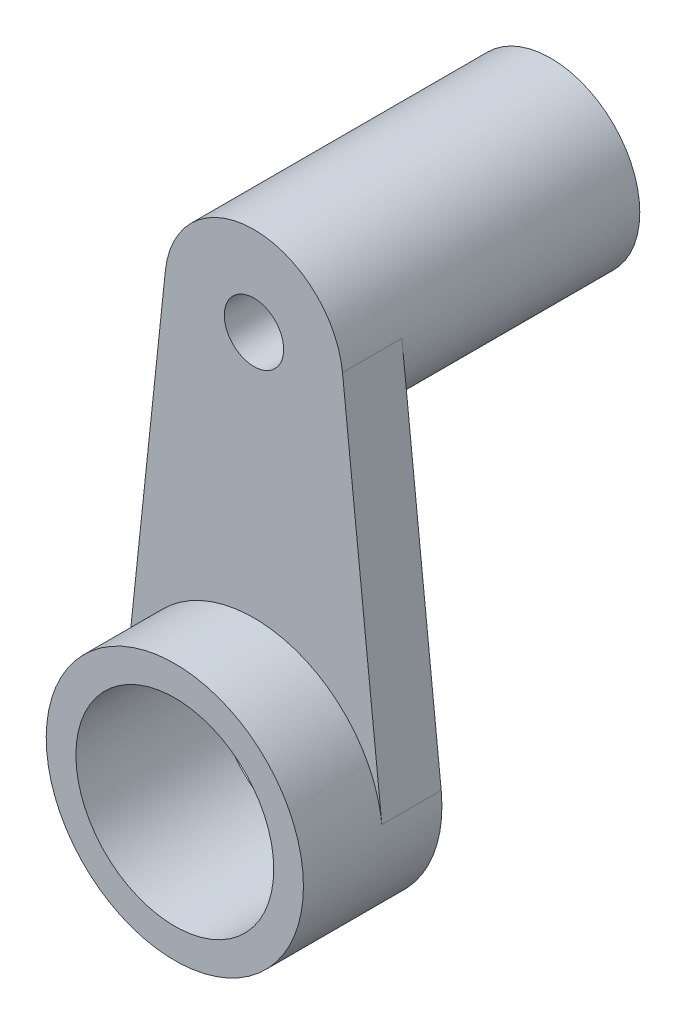
ISO-10303-21;
HEADER;
FILE_DESCRIPTION(('STEP AP214'),'2;1');
FILE_NAME('part.step','',(''),(''),'','','');
FILE_SCHEMA(('AUTOMOTIVE_DESIGN { 1 0 10303 214 1 1 1 1 }'));
ENDSEC;
DATA;
#1=APPLICATION_CONTEXT('core data for automotive mechanical design processes');
#2=APPLICATION_PROTOCOL_DEFINITION('international standard','automotive_design',2000,#1);
#3=PRODUCT_CONTEXT('',#1,'mechanical');
#4=PRODUCT('Part','Part','',(#3));
#5=PRODUCT_RELATED_PRODUCT_CATEGORY('part','',(#4));
#6=PRODUCT_DEFINITION_FORMATION('','',#4);
#7=PRODUCT_DEFINITION_CONTEXT('part definition',#1,'design');
#8=PRODUCT_DEFINITION('design','',#6,#7);
#9=PRODUCT_DEFINITION_SHAPE('','',#8);
#10=(LENGTH_UNIT() NAMED_UNIT(*) SI_UNIT(.MILLI.,.METRE.));
#11=(NAMED_UNIT(*) PLANE_ANGLE_UNIT() SI_UNIT($,.RADIAN.));
#12=(NAMED_UNIT(*) SI_UNIT($,.STERADIAN.) SOLID_ANGLE_UNIT());
#13=UNCERTAINTY_MEASURE_WITH_UNIT(LENGTH_MEASURE(1.E-05),#10,'distance_accuracy_value','');
#14=(GEOMETRIC_REPRESENTATION_CONTEXT(3) GLOBAL_UNCERTAINTY_ASSIGNED_CONTEXT((#13)) GLOBAL_UNIT_ASSIGNED_CONTEXT((#10,
#11,#12)) REPRESENTATION_CONTEXT('',''));
#15=CARTESIAN_POINT('',(0.,0.,0.));
#16=DIRECTION('',(0.,0.,1.));
#17=DIRECTION('',(1.,0.,0.));
#18=AXIS2_PLACEMENT_3D('',#15,#16,#17);
#19=CARTESIAN_POINT('',(0.,0.,6.));
#20=DIRECTION('',(0.,0.,-1.));
#21=DIRECTION('',(-1.,0.,0.));
#22=AXIS2_PLACEMENT_3D('',#19,#20,#21);
#23=CYLINDRICAL_SURFACE('',#22,13.);
#24=CARTESIAN_POINT('',(0.,0.,0.));
#25=DIRECTION('',(0.,0.,1.));
#26=DIRECTION('',(1.,0.,0.));
#27=AXIS2_PLACEMENT_3D('',#24,#25,#26);
#28=CIRCLE('',#27,13.);
#29=CARTESIAN_POINT('',(-12.9277772189466,1.36842105263158,0.));
#30=VERTEX_POINT('',#29);
#31=CARTESIAN_POINT('',(12.9277772189466,1.36842105263158,0.));
#32=VERTEX_POINT('',#31);
#33=EDGE_CURVE('E98',#30,#32,#28,.T.);
#34=ORIENTED_EDGE('',*,*,#33,.T.);
#35=DIRECTION('',(0.,0.,-1.));
#36=VECTOR('',#35,1.);
#37=CARTESIAN_POINT('',(12.9277772189466,1.36842105263158,6.));
#38=LINE('',#37,#36);
#39=CARTESIAN_POINT('',(12.9277772189466,1.36842105263158,6.));
#40=VERTEX_POINT('',#39);
#41=EDGE_CURVE('E48',#40,#32,#38,.T.);
#42=ORIENTED_EDGE('',*,*,#41,.F.);
#43=CARTESIAN_POINT('',(0.,0.,6.));
#44=DIRECTION('',(0.,0.,1.));
#45=DIRECTION('',(1.,0.,0.));
#46=AXIS2_PLACEMENT_3D('',#43,#44,#45);
#47=CIRCLE('',#46,13.);
#48=CARTESIAN_POINT('',(-12.9277772189466,1.36842105263158,6.));
#49=VERTEX_POINT('',#48);
#50=EDGE_CURVE('E125',#40,#49,#47,.T.);
#51=ORIENTED_EDGE('',*,*,#50,.T.);
#52=DIRECTION('',(0.,0.,-1.));
#53=VECTOR('',#52,1.);
#54=CARTESIAN_POINT('',(-12.9277772189466,1.36842105263158,6.));
#55=LINE('',#54,#53);
#56=EDGE_CURVE('E93',#49,#30,#55,.T.);
#57=ORIENTED_EDGE('',*,*,#56,.T.);
#58=EDGE_LOOP('',(#34,#42,#51,#57));
#59=FACE_BOUND('',#58,.T.);
#60=CARTESIAN_POINT('',(0.,0.,14.));
#61=DIRECTION('',(0.,0.,1.));
#62=DIRECTION('',(1.,0.,0.));
#63=AXIS2_PLACEMENT_3D('',#60,#61,#62);
#64=CIRCLE('',#63,13.);
#65=CARTESIAN_POINT('',(13.,0.,14.));
#66=VERTEX_POINT('',#65);
#67=EDGE_CURVE('E127',#66,#66,#64,.T.);
#68=ORIENTED_EDGE('',*,*,#67,.F.);
#69=EDGE_LOOP('',(#68));
#70=FACE_BOUND('',#69,.T.);
#71=ADVANCED_FACE('F39',(#59,#70),#23,.T.);
#72=CARTESIAN_POINT('',(12.9277772189466,1.36842105263158,6.));
#73=DIRECTION('',(-0.994444401457431,-0.105263157894737,0.));
#74=DIRECTION('',(0.105263157894737,-0.994444401457431,0.));
#75=AXIS2_PLACEMENT_3D('',#72,#73,#74);
#76=PLANE('',#75);
#77=DIRECTION('',(-0.105263157894737,0.994444401457431,0.));
#78=VECTOR('',#77,1.);
#79=CARTESIAN_POINT('',(12.9277772189466,1.36842105263158,0.));
#80=LINE('',#79,#78);
#81=CARTESIAN_POINT('',(8.94999961311688,38.9473684210526,0.));
#82=VERTEX_POINT('',#81);
#83=EDGE_CURVE('E99',#32,#82,#80,.T.);
#84=ORIENTED_EDGE('',*,*,#83,.T.);
#85=DIRECTION('',(0.,0.,-1.));
#86=VECTOR('',#85,1.);
#87=CARTESIAN_POINT('',(8.94999961311688,38.9473684210526,6.));
#88=LINE('',#87,#86);
#89=CARTESIAN_POINT('',(8.94999961311688,38.9473684210526,6.));
#90=VERTEX_POINT('',#89);
#91=EDGE_CURVE('E91',#90,#82,#88,.T.);
#92=ORIENTED_EDGE('',*,*,#91,.F.);
#93=DIRECTION('',(-0.105263157894737,0.994444401457431,0.));
#94=VECTOR('',#93,1.);
#95=CARTESIAN_POINT('',(12.9277772189466,1.36842105263158,6.));
#96=LINE('',#95,#94);
#97=EDGE_CURVE('E78',#40,#90,#96,.T.);
#98=ORIENTED_EDGE('',*,*,#97,.F.);
#99=ORIENTED_EDGE('',*,*,#41,.T.);
#100=EDGE_LOOP('',(#84,#92,#98,#99));
#101=FACE_BOUND('',#100,.T.);
#102=ADVANCED_FACE('F149',(#101),#76,.F.);
#103=CARTESIAN_POINT('',(0.,38.,6.));
#104=DIRECTION('',(0.,0.,-1.));
#105=DIRECTION('',(-1.,0.,0.));
#106=AXIS2_PLACEMENT_3D('',#103,#104,#105);
#107=CYLINDRICAL_SURFACE('',#106,9.);
#108=ORIENTED_EDGE('',*,*,#91,.T.);
#109=CARTESIAN_POINT('',(0.,38.,0.));
#110=DIRECTION('',(0.,0.,1.));
#111=DIRECTION('',(1.,0.,0.));
#112=AXIS2_PLACEMENT_3D('',#109,#110,#111);
#113=CIRCLE('',#112,9.);
#114=CARTESIAN_POINT('',(-8.94999961311688,38.9473684210526,0.));
#115=VERTEX_POINT('',#114);
#116=EDGE_CURVE('E11',#115,#82,#113,.T.);
#117=ORIENTED_EDGE('',*,*,#116,.F.);
#118=DIRECTION('',(0.,0.,-1.));
#119=VECTOR('',#118,1.);
#120=CARTESIAN_POINT('',(-8.94999961311687,38.9473684210526,6.));
#121=LINE('',#120,#119);
#122=CARTESIAN_POINT('',(-8.94999961311687,38.9473684210526,6.));
#123=VERTEX_POINT('',#122);
#124=EDGE_CURVE('E90',#123,#115,#121,.T.);
#125=ORIENTED_EDGE('',*,*,#124,.F.);
#126=CARTESIAN_POINT('',(0.,38.,6.));
#127=DIRECTION('',(0.,0.,1.));
#128=DIRECTION('',(1.,0.,0.));
#129=AXIS2_PLACEMENT_3D('',#126,#127,#128);
#130=CIRCLE('',#129,9.);
#131=EDGE_CURVE('E101',#90,#123,#130,.T.);
#132=ORIENTED_EDGE('',*,*,#131,.F.);
#133=EDGE_LOOP('',(#108,#117,#125,#132));
#134=FACE_BOUND('',#133,.T.);
#135=CARTESIAN_POINT('',(0.,38.,-24.));
#136=DIRECTION('',(0.,0.,1.));
#137=DIRECTION('',(1.,0.,0.));
#138=AXIS2_PLACEMENT_3D('',#135,#136,#137);
#139=CIRCLE('',#138,9.);
#140=CARTESIAN_POINT('',(9.,38.,-24.));
#141=VERTEX_POINT('',#140);
#142=EDGE_CURVE('E123',#141,#141,#139,.T.);
#143=ORIENTED_EDGE('',*,*,#142,.T.);
#144=EDGE_LOOP('',(#143));
#145=FACE_BOUND('',#144,.T.);
#146=ADVANCED_FACE('F87',(#134,#145),#107,.T.);
#147=CARTESIAN_POINT('',(-12.9277772189466,1.36842105263158,6.));
#148=DIRECTION('',(0.994444401457431,-0.105263157894737,0.));
#149=DIRECTION('',(0.105263157894737,0.994444401457431,0.));
#150=AXIS2_PLACEMENT_3D('',#147,#148,#149);
#151=PLANE('',#150);
#152=DIRECTION('',(-0.105263157894737,-0.994444401457431,0.));
#153=VECTOR('',#152,1.);
#154=CARTESIAN_POINT('',(-12.9277772189466,1.36842105263158,0.));
#155=LINE('',#154,#153);
#156=EDGE_CURVE('E74',#115,#30,#155,.T.);
#157=ORIENTED_EDGE('',*,*,#156,.T.);
#158=ORIENTED_EDGE('',*,*,#56,.F.);
#159=DIRECTION('',(-0.105263157894737,-0.994444401457431,0.));
#160=VECTOR('',#159,1.);
#161=CARTESIAN_POINT('',(-12.9277772189466,1.36842105263158,6.));
#162=LINE('',#161,#160);
#163=EDGE_CURVE('E57',#123,#49,#162,.T.);
#164=ORIENTED_EDGE('',*,*,#163,.F.);
#165=ORIENTED_EDGE('',*,*,#124,.T.);
#166=EDGE_LOOP('',(#157,#158,#164,#165));
#167=FACE_BOUND('',#166,.T.);
#168=ADVANCED_FACE('F92',(#167),#151,.F.);
#169=CARTESIAN_POINT('',(0.,0.,6.));
#170=DIRECTION('',(0.,0.,1.));
#171=DIRECTION('',(1.,0.,0.));
#172=AXIS2_PLACEMENT_3D('',#169,#170,#171);
#173=PLANE('',#172);
#174=CARTESIAN_POINT('',(0.,38.,6.));
#175=DIRECTION('',(0.,0.,1.));
#176=DIRECTION('',(1.,0.,0.));
#177=AXIS2_PLACEMENT_3D('',#174,#175,#176);
#178=CIRCLE('',#177,3.);
#179=CARTESIAN_POINT('',(3.,38.,6.));
#180=VERTEX_POINT('',#179);
#181=EDGE_CURVE('E111',#180,#180,#178,.T.);
#182=ORIENTED_EDGE('',*,*,#181,.F.);
#183=EDGE_LOOP('',(#182));
#184=FACE_BOUND('',#183,.T.);
#185=ORIENTED_EDGE('',*,*,#50,.F.);
#186=ORIENTED_EDGE('',*,*,#97,.T.);
#187=ORIENTED_EDGE('',*,*,#131,.T.);
#188=ORIENTED_EDGE('',*,*,#163,.T.);
#189=EDGE_LOOP('',(#185,#186,#187,#188));
#190=FACE_BOUND('',#189,.T.);
#191=ADVANCED_FACE('F135',(#184,#190),#173,.T.);
#192=CARTESIAN_POINT('',(0.,0.,0.));
#193=DIRECTION('',(0.,0.,1.));
#194=DIRECTION('',(1.,0.,0.));
#195=AXIS2_PLACEMENT_3D('',#192,#193,#194);
#196=PLANE('',#195);
#197=CARTESIAN_POINT('',(0.,0.,0.));
#198=DIRECTION('',(0.,0.,1.));
#199=DIRECTION('',(1.,0.,0.));
#200=AXIS2_PLACEMENT_3D('',#197,#198,#199);
#201=CIRCLE('',#200,10.);
#202=CARTESIAN_POINT('',(10.,0.,0.));
#203=VERTEX_POINT('',#202);
#204=EDGE_CURVE('E119',#203,#203,#201,.T.);
#205=ORIENTED_EDGE('',*,*,#204,.T.);
#206=EDGE_LOOP('',(#205));
#207=FACE_BOUND('',#206,.T.);
#208=ORIENTED_EDGE('',*,*,#156,.F.);
#209=ORIENTED_EDGE('',*,*,#116,.T.);
#210=ORIENTED_EDGE('',*,*,#83,.F.);
#211=ORIENTED_EDGE('',*,*,#33,.F.);
#212=EDGE_LOOP('',(#208,#209,#210,#211));
#213=FACE_BOUND('',#212,.T.);
#214=ADVANCED_FACE('F96',(#207,#213),#196,.F.);
#215=CARTESIAN_POINT('',(0.,0.,14.));
#216=DIRECTION('',(0.,0.,1.));
#217=DIRECTION('',(1.,0.,0.));
#218=AXIS2_PLACEMENT_3D('',#215,#216,#217);
#219=PLANE('',#218);
#220=CARTESIAN_POINT('',(0.,0.,14.));
#221=DIRECTION('',(0.,0.,1.));
#222=DIRECTION('',(1.,0.,0.));
#223=AXIS2_PLACEMENT_3D('',#220,#221,#222);
#224=CIRCLE('',#223,10.);
#225=CARTESIAN_POINT('',(10.,0.,14.));
#226=VERTEX_POINT('',#225);
#227=EDGE_CURVE('E42',#226,#226,#224,.T.);
#228=ORIENTED_EDGE('',*,*,#227,.F.);
#229=EDGE_LOOP('',(#228));
#230=FACE_BOUND('',#229,.T.);
#231=ORIENTED_EDGE('',*,*,#67,.T.);
#232=EDGE_LOOP('',(#231));
#233=FACE_BOUND('',#232,.T.);
#234=ADVANCED_FACE('F143',(#230,#233),#219,.T.);
#235=CARTESIAN_POINT('',(0.,38.,-24.));
#236=DIRECTION('',(0.,0.,1.));
#237=DIRECTION('',(1.,0.,0.));
#238=AXIS2_PLACEMENT_3D('',#235,#236,#237);
#239=PLANE('',#238);
#240=CARTESIAN_POINT('',(0.,38.,-24.));
#241=DIRECTION('',(0.,0.,1.));
#242=DIRECTION('',(1.,0.,0.));
#243=AXIS2_PLACEMENT_3D('',#240,#241,#242);
#244=CIRCLE('',#243,3.);
#245=CARTESIAN_POINT('',(3.,38.,-24.));
#246=VERTEX_POINT('',#245);
#247=EDGE_CURVE('E109',#246,#246,#244,.T.);
#248=ORIENTED_EDGE('',*,*,#247,.T.);
#249=EDGE_LOOP('',(#248));
#250=FACE_BOUND('',#249,.T.);
#251=ORIENTED_EDGE('',*,*,#142,.F.);
#252=EDGE_LOOP('',(#251));
#253=FACE_BOUND('',#252,.T.);
#254=ADVANCED_FACE('F194',(#250,#253),#239,.F.);
#255=CARTESIAN_POINT('',(0.,38.,-30.));
#256=DIRECTION('',(0.,0.,1.));
#257=DIRECTION('',(1.,0.,0.));
#258=AXIS2_PLACEMENT_3D('',#255,#256,#257);
#259=CYLINDRICAL_SURFACE('',#258,3.);
#260=ORIENTED_EDGE('',*,*,#181,.T.);
#261=EDGE_LOOP('',(#260));
#262=FACE_BOUND('',#261,.T.);
#263=ORIENTED_EDGE('',*,*,#247,.F.);
#264=EDGE_LOOP('',(#263));
#265=FACE_BOUND('',#264,.T.);
#266=ADVANCED_FACE('F202',(#262,#265),#259,.F.);
#267=CARTESIAN_POINT('',(0.,0.,-30.));
#268=DIRECTION('',(0.,0.,1.));
#269=DIRECTION('',(1.,0.,0.));
#270=AXIS2_PLACEMENT_3D('',#267,#268,#269);
#271=CYLINDRICAL_SURFACE('',#270,10.);
#272=ORIENTED_EDGE('',*,*,#227,.T.);
#273=EDGE_LOOP('',(#272));
#274=FACE_BOUND('',#273,.T.);
#275=ORIENTED_EDGE('',*,*,#204,.F.);
#276=EDGE_LOOP('',(#275));
#277=FACE_BOUND('',#276,.T.);
#278=ADVANCED_FACE('F209',(#274,#277),#271,.F.);
#279=CLOSED_SHELL('',(#71,#102,#146,#168,#191,#214,#234,#254,#266,#278));
#280=MANIFOLD_SOLID_BREP('B2',#279);
#281=ADVANCED_BREP_SHAPE_REPRESENTATION('',(#18,#280),#14);
#282=SHAPE_DEFINITION_REPRESENTATION(#9,#281);
ENDSEC;
END-ISO-10303-21;
